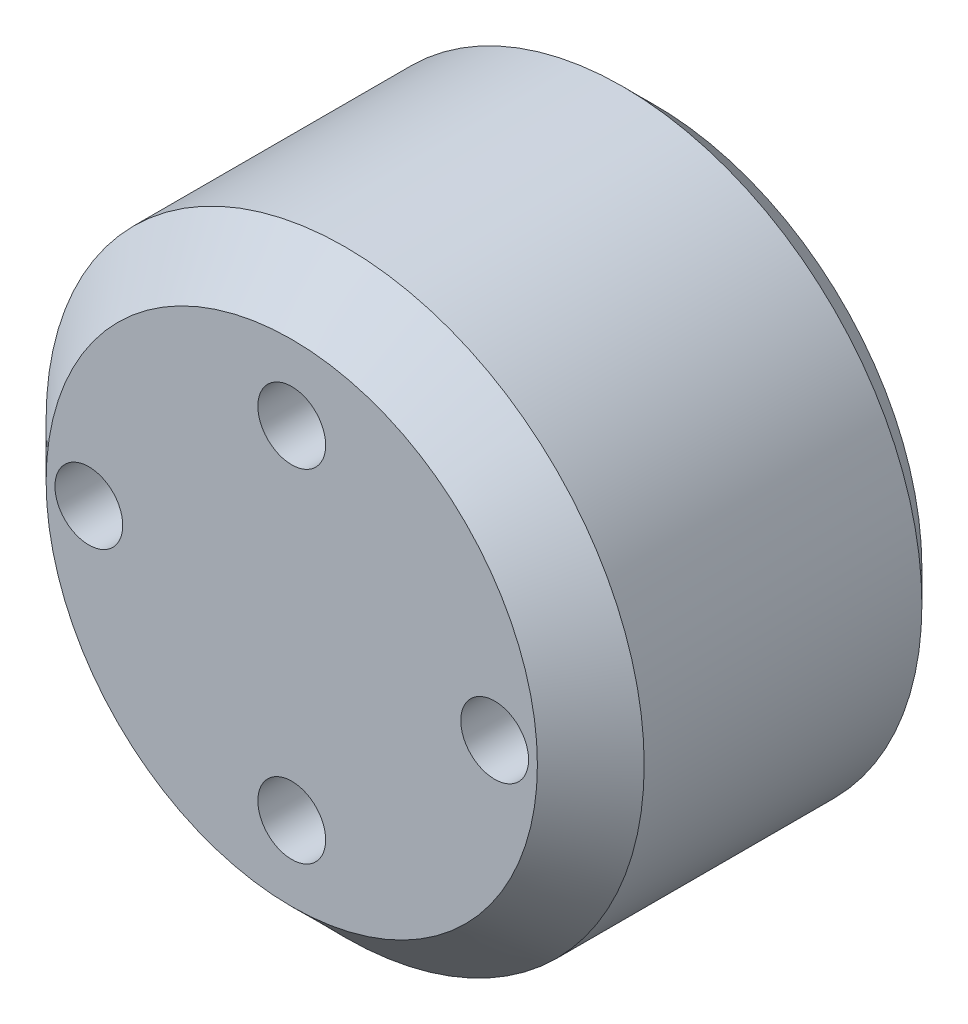
ISO-10303-21;
HEADER;
FILE_DESCRIPTION(('STEP AP214'),'2;1');
FILE_NAME('part.step','',(''),(''),'','','');
FILE_SCHEMA(('AUTOMOTIVE_DESIGN { 1 0 10303 214 1 1 1 1 }'));
ENDSEC;
DATA;
#1=APPLICATION_CONTEXT('core data for automotive mechanical design processes');
#2=APPLICATION_PROTOCOL_DEFINITION('international standard','automotive_design',2000,#1);
#3=PRODUCT_CONTEXT('',#1,'mechanical');
#4=PRODUCT('Part','Part','',(#3));
#5=PRODUCT_RELATED_PRODUCT_CATEGORY('part','',(#4));
#6=PRODUCT_DEFINITION_FORMATION('','',#4);
#7=PRODUCT_DEFINITION_CONTEXT('part definition',#1,'design');
#8=PRODUCT_DEFINITION('design','',#6,#7);
#9=PRODUCT_DEFINITION_SHAPE('','',#8);
#10=(LENGTH_UNIT() NAMED_UNIT(*) SI_UNIT(.MILLI.,.METRE.));
#11=(NAMED_UNIT(*) PLANE_ANGLE_UNIT() SI_UNIT($,.RADIAN.));
#12=(NAMED_UNIT(*) SI_UNIT($,.STERADIAN.) SOLID_ANGLE_UNIT());
#13=UNCERTAINTY_MEASURE_WITH_UNIT(LENGTH_MEASURE(1.E-05),#10,'distance_accuracy_value','');
#14=(GEOMETRIC_REPRESENTATION_CONTEXT(3) GLOBAL_UNCERTAINTY_ASSIGNED_CONTEXT((#13)) GLOBAL_UNIT_ASSIGNED_CONTEXT((#10,
#11,#12)) REPRESENTATION_CONTEXT('',''));
#15=CARTESIAN_POINT('',(0.,0.,0.));
#16=DIRECTION('',(0.,0.,1.));
#17=DIRECTION('',(1.,0.,0.));
#18=AXIS2_PLACEMENT_3D('',#15,#16,#17);
#19=CARTESIAN_POINT('',(-17.5533457997957,7.42581420726219,0.));
#20=DIRECTION('',(0.,0.,1.));
#21=DIRECTION('',(1.,0.,0.));
#22=AXIS2_PLACEMENT_3D('',#19,#20,#21);
#23=PLANE('',#22);
#24=CARTESIAN_POINT('',(-17.5533457997957,7.42581420726219,0.));
#25=DIRECTION('',(0.,0.,1.));
#26=DIRECTION('',(1.,0.,0.));
#27=AXIS2_PLACEMENT_3D('',#24,#25,#26);
#28=CIRCLE('',#27,12.5);
#29=CARTESIAN_POINT('',(-5.05334579979576,7.42581420726219,0.));
#30=VERTEX_POINT('',#29);
#31=EDGE_CURVE('E61',#30,#30,#28,.F.);
#32=ORIENTED_EDGE('',*,*,#31,.T.);
#33=EDGE_LOOP('',(#32));
#34=FACE_BOUND('',#33,.T.);
#35=CARTESIAN_POINT('',(-17.5533457997957,7.42581420726219,0.));
#36=DIRECTION('',(0.,0.,1.));
#37=DIRECTION('',(1.,0.,0.));
#38=AXIS2_PLACEMENT_3D('',#35,#36,#37);
#39=CIRCLE('',#38,3.);
#40=CARTESIAN_POINT('',(-14.5533457997957,7.42581420726219,0.));
#41=VERTEX_POINT('',#40);
#42=EDGE_CURVE('E67',#41,#41,#39,.F.);
#43=ORIENTED_EDGE('',*,*,#42,.F.);
#44=EDGE_LOOP('',(#43));
#45=FACE_BOUND('',#44,.T.);
#46=ADVANCED_FACE('F41',(#34,#45),#23,.F.);
#47=CARTESIAN_POINT('',(-17.5533457997957,7.42581420726219,17.));
#48=DIRECTION('',(0.,0.,-1.));
#49=DIRECTION('',(-1.,0.,0.));
#50=AXIS2_PLACEMENT_3D('',#47,#48,#49);
#51=CYLINDRICAL_SURFACE('',#50,14.);
#52=CARTESIAN_POINT('',(-17.5533457997957,7.42581420726219,14.5));
#53=DIRECTION('',(0.,0.,1.));
#54=DIRECTION('',(1.,0.,0.));
#55=AXIS2_PLACEMENT_3D('',#52,#53,#54);
#56=CIRCLE('',#55,14.);
#57=CARTESIAN_POINT('',(-3.55334579979575,7.42581420726219,14.5));
#58=VERTEX_POINT('',#57);
#59=EDGE_CURVE('E11',#58,#58,#56,.F.);
#60=ORIENTED_EDGE('',*,*,#59,.T.);
#61=EDGE_LOOP('',(#60));
#62=FACE_BOUND('',#61,.T.);
#63=CARTESIAN_POINT('',(-17.5533457997957,7.42581420726219,1.50000000000001));
#64=DIRECTION('',(0.,0.,1.));
#65=DIRECTION('',(1.,0.,0.));
#66=AXIS2_PLACEMENT_3D('',#63,#64,#65);
#67=CIRCLE('',#66,14.);
#68=CARTESIAN_POINT('',(-3.55334579979575,7.42581420726219,1.50000000000001));
#69=VERTEX_POINT('',#68);
#70=EDGE_CURVE('E64',#69,#69,#67,.T.);
#71=ORIENTED_EDGE('',*,*,#70,.T.);
#72=EDGE_LOOP('',(#71));
#73=FACE_BOUND('',#72,.T.);
#74=ADVANCED_FACE('F101',(#62,#73),#51,.T.);
#75=CARTESIAN_POINT('',(-17.5533457997957,7.42581420726219,17.));
#76=DIRECTION('',(0.,0.,1.));
#77=DIRECTION('',(1.,0.,0.));
#78=AXIS2_PLACEMENT_3D('',#75,#76,#77);
#79=PLANE('',#78);
#80=CARTESIAN_POINT('',(-17.5533457997957,7.42581420726219,17.));
#81=DIRECTION('',(0.,0.,1.));
#82=DIRECTION('',(1.,0.,0.));
#83=AXIS2_PLACEMENT_3D('',#80,#81,#82);
#84=CIRCLE('',#83,11.5);
#85=CARTESIAN_POINT('',(-6.05334579979574,7.42581420726219,17.));
#86=VERTEX_POINT('',#85);
#87=EDGE_CURVE('E48',#86,#86,#84,.T.);
#88=ORIENTED_EDGE('',*,*,#87,.T.);
#89=EDGE_LOOP('',(#88));
#90=FACE_BOUND('',#89,.T.);
#91=CARTESIAN_POINT('',(-17.5533457997957,15.4258142072622,17.));
#92=DIRECTION('',(0.,0.,1.));
#93=DIRECTION('',(1.,0.,0.));
#94=AXIS2_PLACEMENT_3D('',#91,#92,#93);
#95=CIRCLE('',#94,1.5875);
#96=CARTESIAN_POINT('',(-15.9658457997957,15.4258142072622,17.));
#97=VERTEX_POINT('',#96);
#98=EDGE_CURVE('E86',#97,#97,#95,.T.);
#99=ORIENTED_EDGE('',*,*,#98,.F.);
#100=EDGE_LOOP('',(#99));
#101=FACE_BOUND('',#100,.T.);
#102=CARTESIAN_POINT('',(-8.05334579979575,7.42581420726219,17.));
#103=DIRECTION('',(0.,0.,1.));
#104=DIRECTION('',(1.,0.,0.));
#105=AXIS2_PLACEMENT_3D('',#102,#103,#104);
#106=CIRCLE('',#105,1.5875);
#107=CARTESIAN_POINT('',(-6.46584579979575,7.42581420726219,17.));
#108=VERTEX_POINT('',#107);
#109=EDGE_CURVE('E80',#108,#108,#106,.T.);
#110=ORIENTED_EDGE('',*,*,#109,.F.);
#111=EDGE_LOOP('',(#110));
#112=FACE_BOUND('',#111,.T.);
#113=CARTESIAN_POINT('',(-17.5533457997957,-0.574185792737808,17.));
#114=DIRECTION('',(0.,0.,1.));
#115=DIRECTION('',(1.,0.,0.));
#116=AXIS2_PLACEMENT_3D('',#113,#114,#115);
#117=CIRCLE('',#116,1.5875);
#118=CARTESIAN_POINT('',(-15.9658457997957,-0.574185792737808,17.));
#119=VERTEX_POINT('',#118);
#120=EDGE_CURVE('E74',#119,#119,#117,.T.);
#121=ORIENTED_EDGE('',*,*,#120,.F.);
#122=EDGE_LOOP('',(#121));
#123=FACE_BOUND('',#122,.T.);
#124=CARTESIAN_POINT('',(-27.0533457997957,7.42581420726219,17.));
#125=DIRECTION('',(0.,0.,1.));
#126=DIRECTION('',(1.,0.,0.));
#127=AXIS2_PLACEMENT_3D('',#124,#125,#126);
#128=CIRCLE('',#127,1.5875);
#129=CARTESIAN_POINT('',(-25.4658457997958,7.42581420726219,17.));
#130=VERTEX_POINT('',#129);
#131=EDGE_CURVE('E71',#130,#130,#128,.T.);
#132=ORIENTED_EDGE('',*,*,#131,.F.);
#133=EDGE_LOOP('',(#132));
#134=FACE_BOUND('',#133,.T.);
#135=ADVANCED_FACE('F97',(#90,#101,#112,#123,#134),#79,.T.);
#136=CARTESIAN_POINT('',(-17.5533457997957,7.42581420726219,-5.));
#137=DIRECTION('',(0.,0.,1.));
#138=DIRECTION('',(1.,0.,0.));
#139=AXIS2_PLACEMENT_3D('',#136,#137,#138);
#140=CYLINDRICAL_SURFACE('',#139,3.);
#141=CARTESIAN_POINT('',(-17.5533457997957,7.42581420726219,-4.49999999999999));
#142=DIRECTION('',(0.,0.,-1.));
#143=DIRECTION('',(-1.,0.,0.));
#144=AXIS2_PLACEMENT_3D('',#141,#142,#143);
#145=CIRCLE('',#144,3.);
#146=CARTESIAN_POINT('',(-20.5533457997957,7.42581420726219,-4.49999999999999));
#147=VERTEX_POINT('',#146);
#148=EDGE_CURVE('E52',#147,#147,#145,.F.);
#149=ORIENTED_EDGE('',*,*,#148,.T.);
#150=EDGE_LOOP('',(#149));
#151=FACE_BOUND('',#150,.T.);
#152=ORIENTED_EDGE('',*,*,#42,.T.);
#153=EDGE_LOOP('',(#152));
#154=FACE_BOUND('',#153,.T.);
#155=ADVANCED_FACE('F100',(#151,#154),#140,.T.);
#156=CARTESIAN_POINT('',(-17.5533457997957,7.42581420726219,-5.));
#157=DIRECTION('',(0.,0.,-1.));
#158=DIRECTION('',(-1.,0.,0.));
#159=AXIS2_PLACEMENT_3D('',#156,#157,#158);
#160=PLANE('',#159);
#161=CARTESIAN_POINT('',(-17.5533457997957,7.42581420726219,-5.));
#162=DIRECTION('',(0.,0.,-1.));
#163=DIRECTION('',(-1.,0.,0.));
#164=AXIS2_PLACEMENT_3D('',#161,#162,#163);
#165=CIRCLE('',#164,2.5);
#166=CARTESIAN_POINT('',(-20.0533457997957,7.42581420726219,-5.));
#167=VERTEX_POINT('',#166);
#168=EDGE_CURVE('E56',#167,#167,#165,.T.);
#169=ORIENTED_EDGE('',*,*,#168,.T.);
#170=EDGE_LOOP('',(#169));
#171=FACE_BOUND('',#170,.T.);
#172=ADVANCED_FACE('F112',(#171),#160,.T.);
#173=CARTESIAN_POINT('',(-27.0533457997957,7.42581420726219,7.));
#174=DIRECTION('',(0.,0.,1.));
#175=DIRECTION('',(1.,0.,0.));
#176=AXIS2_PLACEMENT_3D('',#173,#174,#175);
#177=CYLINDRICAL_SURFACE('',#176,1.5875);
#178=CARTESIAN_POINT('',(-27.0533457997957,7.42581420726219,7.));
#179=DIRECTION('',(0.,0.,1.));
#180=DIRECTION('',(1.,0.,0.));
#181=AXIS2_PLACEMENT_3D('',#178,#179,#180);
#182=CIRCLE('',#181,1.5875);
#183=CARTESIAN_POINT('',(-25.4658457997958,7.42581420726219,7.));
#184=VERTEX_POINT('',#183);
#185=EDGE_CURVE('E70',#184,#184,#182,.T.);
#186=ORIENTED_EDGE('',*,*,#185,.F.);
#187=EDGE_LOOP('',(#186));
#188=FACE_BOUND('',#187,.T.);
#189=ORIENTED_EDGE('',*,*,#131,.T.);
#190=EDGE_LOOP('',(#189));
#191=FACE_BOUND('',#190,.T.);
#192=ADVANCED_FACE('F109',(#188,#191),#177,.F.);
#193=CARTESIAN_POINT('',(0.,0.,7.));
#194=DIRECTION('',(0.,0.,1.));
#195=DIRECTION('',(1.,0.,0.));
#196=AXIS2_PLACEMENT_3D('',#193,#194,#195);
#197=PLANE('',#196);
#198=ORIENTED_EDGE('',*,*,#185,.T.);
#199=EDGE_LOOP('',(#198));
#200=FACE_BOUND('',#199,.T.);
#201=ADVANCED_FACE('F111',(#200),#197,.T.);
#202=CARTESIAN_POINT('',(-17.5533457997957,-0.574185792737808,7.));
#203=DIRECTION('',(0.,0.,1.));
#204=DIRECTION('',(1.,0.,0.));
#205=AXIS2_PLACEMENT_3D('',#202,#203,#204);
#206=CYLINDRICAL_SURFACE('',#205,1.5875);
#207=CARTESIAN_POINT('',(-17.5533457997957,-0.574185792737808,7.));
#208=DIRECTION('',(0.,0.,1.));
#209=DIRECTION('',(1.,0.,0.));
#210=AXIS2_PLACEMENT_3D('',#207,#208,#209);
#211=CIRCLE('',#210,1.5875);
#212=CARTESIAN_POINT('',(-15.9658457997957,-0.574185792737808,7.));
#213=VERTEX_POINT('',#212);
#214=EDGE_CURVE('E77',#213,#213,#211,.T.);
#215=ORIENTED_EDGE('',*,*,#214,.F.);
#216=EDGE_LOOP('',(#215));
#217=FACE_BOUND('',#216,.T.);
#218=ORIENTED_EDGE('',*,*,#120,.T.);
#219=EDGE_LOOP('',(#218));
#220=FACE_BOUND('',#219,.T.);
#221=ADVANCED_FACE('F119',(#217,#220),#206,.F.);
#222=CARTESIAN_POINT('',(0.,0.,7.));
#223=DIRECTION('',(0.,0.,1.));
#224=DIRECTION('',(1.,0.,0.));
#225=AXIS2_PLACEMENT_3D('',#222,#223,#224);
#226=PLANE('',#225);
#227=ORIENTED_EDGE('',*,*,#214,.T.);
#228=EDGE_LOOP('',(#227));
#229=FACE_BOUND('',#228,.T.);
#230=ADVANCED_FACE('F228',(#229),#226,.T.);
#231=CARTESIAN_POINT('',(-8.05334579979575,7.42581420726219,7.));
#232=DIRECTION('',(0.,0.,1.));
#233=DIRECTION('',(1.,0.,0.));
#234=AXIS2_PLACEMENT_3D('',#231,#232,#233);
#235=CYLINDRICAL_SURFACE('',#234,1.5875);
#236=CARTESIAN_POINT('',(-8.05334579979575,7.42581420726219,7.));
#237=DIRECTION('',(0.,0.,1.));
#238=DIRECTION('',(1.,0.,0.));
#239=AXIS2_PLACEMENT_3D('',#236,#237,#238);
#240=CIRCLE('',#239,1.5875);
#241=CARTESIAN_POINT('',(-6.46584579979575,7.42581420726219,7.));
#242=VERTEX_POINT('',#241);
#243=EDGE_CURVE('E83',#242,#242,#240,.T.);
#244=ORIENTED_EDGE('',*,*,#243,.F.);
#245=EDGE_LOOP('',(#244));
#246=FACE_BOUND('',#245,.T.);
#247=ORIENTED_EDGE('',*,*,#109,.T.);
#248=EDGE_LOOP('',(#247));
#249=FACE_BOUND('',#248,.T.);
#250=ADVANCED_FACE('F220',(#246,#249),#235,.F.);
#251=CARTESIAN_POINT('',(0.,0.,7.));
#252=DIRECTION('',(0.,0.,1.));
#253=DIRECTION('',(1.,0.,0.));
#254=AXIS2_PLACEMENT_3D('',#251,#252,#253);
#255=PLANE('',#254);
#256=ORIENTED_EDGE('',*,*,#243,.T.);
#257=EDGE_LOOP('',(#256));
#258=FACE_BOUND('',#257,.T.);
#259=ADVANCED_FACE('F212',(#258),#255,.T.);
#260=CARTESIAN_POINT('',(-17.5533457997957,15.4258142072622,7.));
#261=DIRECTION('',(0.,0.,1.));
#262=DIRECTION('',(1.,0.,0.));
#263=AXIS2_PLACEMENT_3D('',#260,#261,#262);
#264=CYLINDRICAL_SURFACE('',#263,1.5875);
#265=CARTESIAN_POINT('',(-17.5533457997957,15.4258142072622,7.));
#266=DIRECTION('',(0.,0.,1.));
#267=DIRECTION('',(1.,0.,0.));
#268=AXIS2_PLACEMENT_3D('',#265,#266,#267);
#269=CIRCLE('',#268,1.5875);
#270=CARTESIAN_POINT('',(-15.9658457997957,15.4258142072622,7.));
#271=VERTEX_POINT('',#270);
#272=EDGE_CURVE('E89',#271,#271,#269,.T.);
#273=ORIENTED_EDGE('',*,*,#272,.F.);
#274=EDGE_LOOP('',(#273));
#275=FACE_BOUND('',#274,.T.);
#276=ORIENTED_EDGE('',*,*,#98,.T.);
#277=EDGE_LOOP('',(#276));
#278=FACE_BOUND('',#277,.T.);
#279=ADVANCED_FACE('F95',(#275,#278),#264,.F.);
#280=CARTESIAN_POINT('',(0.,0.,7.));
#281=DIRECTION('',(0.,0.,1.));
#282=DIRECTION('',(1.,0.,0.));
#283=AXIS2_PLACEMENT_3D('',#280,#281,#282);
#284=PLANE('',#283);
#285=ORIENTED_EDGE('',*,*,#272,.T.);
#286=EDGE_LOOP('',(#285));
#287=FACE_BOUND('',#286,.T.);
#288=ADVANCED_FACE('F138',(#287),#284,.T.);
#289=CARTESIAN_POINT('',(-17.5533457997957,7.42581420726219,1.50000000000001));
#290=DIRECTION('',(0.,0.,1.));
#291=DIRECTION('',(1.,0.,0.));
#292=AXIS2_PLACEMENT_3D('',#289,#290,#291);
#293=CONICAL_SURFACE('',#292,14.,0.785398163397451);
#294=ORIENTED_EDGE('',*,*,#31,.F.);
#295=EDGE_LOOP('',(#294));
#296=FACE_BOUND('',#295,.T.);
#297=ORIENTED_EDGE('',*,*,#70,.F.);
#298=EDGE_LOOP('',(#297));
#299=FACE_BOUND('',#298,.T.);
#300=ADVANCED_FACE('F135',(#296,#299),#293,.T.);
#301=CARTESIAN_POINT('',(-17.5533457997957,7.42581420726219,-5.));
#302=DIRECTION('',(0.,0.,1.));
#303=DIRECTION('',(1.,0.,0.));
#304=AXIS2_PLACEMENT_3D('',#301,#302,#303);
#305=CONICAL_SURFACE('',#304,2.5,0.785398163397445);
#306=ORIENTED_EDGE('',*,*,#148,.F.);
#307=EDGE_LOOP('',(#306));
#308=FACE_BOUND('',#307,.T.);
#309=ORIENTED_EDGE('',*,*,#168,.F.);
#310=EDGE_LOOP('',(#309));
#311=FACE_BOUND('',#310,.T.);
#312=ADVANCED_FACE('F137',(#308,#311),#305,.T.);
#313=CARTESIAN_POINT('',(-17.5533457997957,7.42581420726219,17.));
#314=DIRECTION('',(0.,0.,-1.));
#315=DIRECTION('',(-1.,0.,0.));
#316=AXIS2_PLACEMENT_3D('',#313,#314,#315);
#317=CONICAL_SURFACE('',#316,11.5,0.785398163397448);
#318=ORIENTED_EDGE('',*,*,#59,.F.);
#319=EDGE_LOOP('',(#318));
#320=FACE_BOUND('',#319,.T.);
#321=ORIENTED_EDGE('',*,*,#87,.F.);
#322=EDGE_LOOP('',(#321));
#323=FACE_BOUND('',#322,.T.);
#324=ADVANCED_FACE('F43',(#320,#323),#317,.T.);
#325=CLOSED_SHELL('',(#46,#74,#135,#155,#172,#192,#201,#221,#230,#250,#259,#279,#288,#300,#312,#324));
#326=MANIFOLD_SOLID_BREP('B2',#325);
#327=ADVANCED_BREP_SHAPE_REPRESENTATION('',(#18,#326),#14);
#328=SHAPE_DEFINITION_REPRESENTATION(#9,#327);
ENDSEC;
END-ISO-10303-21;
